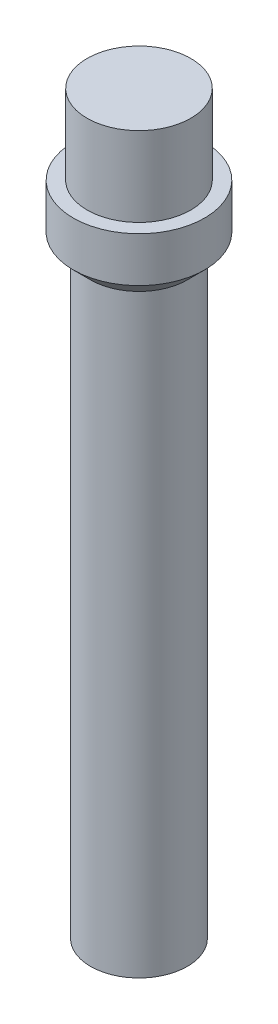
ISO-10303-21;
HEADER;
FILE_DESCRIPTION(('STEP AP214'),'2;1');
FILE_NAME('part.step','',(''),(''),'','','');
FILE_SCHEMA(('AUTOMOTIVE_DESIGN { 1 0 10303 214 1 1 1 1 }'));
ENDSEC;
DATA;
#1=APPLICATION_CONTEXT('core data for automotive mechanical design processes');
#2=APPLICATION_PROTOCOL_DEFINITION('international standard','automotive_design',2000,#1);
#3=PRODUCT_CONTEXT('',#1,'mechanical');
#4=PRODUCT('Part','Part','',(#3));
#5=PRODUCT_RELATED_PRODUCT_CATEGORY('part','',(#4));
#6=PRODUCT_DEFINITION_FORMATION('','',#4);
#7=PRODUCT_DEFINITION_CONTEXT('part definition',#1,'design');
#8=PRODUCT_DEFINITION('design','',#6,#7);
#9=PRODUCT_DEFINITION_SHAPE('','',#8);
#10=(LENGTH_UNIT() NAMED_UNIT(*) SI_UNIT(.MILLI.,.METRE.));
#11=(NAMED_UNIT(*) PLANE_ANGLE_UNIT() SI_UNIT($,.RADIAN.));
#12=(NAMED_UNIT(*) SI_UNIT($,.STERADIAN.) SOLID_ANGLE_UNIT());
#13=UNCERTAINTY_MEASURE_WITH_UNIT(LENGTH_MEASURE(1.E-05),#10,'distance_accuracy_value','');
#14=(GEOMETRIC_REPRESENTATION_CONTEXT(3) GLOBAL_UNCERTAINTY_ASSIGNED_CONTEXT((#13)) GLOBAL_UNIT_ASSIGNED_CONTEXT((#10,
#11,#12)) REPRESENTATION_CONTEXT('',''));
#15=CARTESIAN_POINT('',(0.,0.,0.));
#16=DIRECTION('',(0.,0.,1.));
#17=DIRECTION('',(1.,0.,0.));
#18=AXIS2_PLACEMENT_3D('',#15,#16,#17);
#19=CARTESIAN_POINT('',(0.,2.3,0.));
#20=DIRECTION('',(0.,-1.,0.));
#21=DIRECTION('',(0.,0.,-1.));
#22=AXIS2_PLACEMENT_3D('',#19,#20,#21);
#23=CYLINDRICAL_SURFACE('',#22,1.5);
#24=CARTESIAN_POINT('',(0.,2.3,0.));
#25=DIRECTION('',(0.,1.,0.));
#26=DIRECTION('',(0.,0.,1.));
#27=AXIS2_PLACEMENT_3D('',#24,#25,#26);
#28=CIRCLE('',#27,1.5);
#29=CARTESIAN_POINT('',(0.,2.3,1.5));
#30=VERTEX_POINT('',#29);
#31=EDGE_CURVE('E45',#30,#30,#28,.T.);
#32=ORIENTED_EDGE('',*,*,#31,.F.);
#33=EDGE_LOOP('',(#32));
#34=FACE_BOUND('',#33,.T.);
#35=CARTESIAN_POINT('',(0.,0.,0.));
#36=DIRECTION('',(0.,1.,0.));
#37=DIRECTION('',(0.,0.,1.));
#38=AXIS2_PLACEMENT_3D('',#35,#36,#37);
#39=CIRCLE('',#38,1.5);
#40=CARTESIAN_POINT('',(0.,0.,1.5));
#41=VERTEX_POINT('',#40);
#42=EDGE_CURVE('E50',#41,#41,#39,.T.);
#43=ORIENTED_EDGE('',*,*,#42,.T.);
#44=EDGE_LOOP('',(#43));
#45=FACE_BOUND('',#44,.T.);
#46=ADVANCED_FACE('F37',(#34,#45),#23,.T.);
#47=CARTESIAN_POINT('',(0.,2.3,0.));
#48=DIRECTION('',(0.,1.,0.));
#49=DIRECTION('',(0.,0.,1.));
#50=AXIS2_PLACEMENT_3D('',#47,#48,#49);
#51=PLANE('',#50);
#52=ORIENTED_EDGE('',*,*,#31,.T.);
#53=EDGE_LOOP('',(#52));
#54=FACE_BOUND('',#53,.T.);
#55=ADVANCED_FACE('F83',(#54),#51,.T.);
#56=CARTESIAN_POINT('',(0.,-1.3,0.));
#57=DIRECTION('',(0.,1.,0.));
#58=DIRECTION('',(0.,0.,1.));
#59=AXIS2_PLACEMENT_3D('',#56,#57,#58);
#60=CYLINDRICAL_SURFACE('',#59,1.9);
#61=CARTESIAN_POINT('',(0.,-1.3,0.));
#62=DIRECTION('',(0.,1.,0.));
#63=DIRECTION('',(0.,0.,1.));
#64=AXIS2_PLACEMENT_3D('',#61,#62,#63);
#65=CIRCLE('',#64,1.9);
#66=CARTESIAN_POINT('',(0.,-1.3,1.9));
#67=VERTEX_POINT('',#66);
#68=EDGE_CURVE('E56',#67,#67,#65,.T.);
#69=ORIENTED_EDGE('',*,*,#68,.T.);
#70=EDGE_LOOP('',(#69));
#71=FACE_BOUND('',#70,.T.);
#72=CARTESIAN_POINT('',(0.,0.,0.));
#73=DIRECTION('',(0.,1.,0.));
#74=DIRECTION('',(0.,0.,1.));
#75=AXIS2_PLACEMENT_3D('',#72,#73,#74);
#76=CIRCLE('',#75,1.9);
#77=CARTESIAN_POINT('',(0.,0.,1.9));
#78=VERTEX_POINT('',#77);
#79=EDGE_CURVE('E58',#78,#78,#76,.T.);
#80=ORIENTED_EDGE('',*,*,#79,.F.);
#81=EDGE_LOOP('',(#80));
#82=FACE_BOUND('',#81,.T.);
#83=ADVANCED_FACE('F88',(#71,#82),#60,.T.);
#84=CARTESIAN_POINT('',(0.,0.,0.));
#85=DIRECTION('',(0.,1.,0.));
#86=DIRECTION('',(0.,0.,1.));
#87=AXIS2_PLACEMENT_3D('',#84,#85,#86);
#88=PLANE('',#87);
#89=ORIENTED_EDGE('',*,*,#42,.F.);
#90=EDGE_LOOP('',(#89));
#91=FACE_BOUND('',#90,.T.);
#92=ORIENTED_EDGE('',*,*,#79,.T.);
#93=EDGE_LOOP('',(#92));
#94=FACE_BOUND('',#93,.T.);
#95=ADVANCED_FACE('F80',(#91,#94),#88,.T.);
#96=CARTESIAN_POINT('',(0.,-19.,0.));
#97=DIRECTION('',(0.,1.,0.));
#98=DIRECTION('',(0.,0.,1.));
#99=AXIS2_PLACEMENT_3D('',#96,#97,#98);
#100=CYLINDRICAL_SURFACE('',#99,1.4);
#101=CARTESIAN_POINT('',(0.,-1.8,0.));
#102=DIRECTION('',(0.,1.,0.));
#103=DIRECTION('',(0.,0.,1.));
#104=AXIS2_PLACEMENT_3D('',#101,#102,#103);
#105=CIRCLE('',#104,1.4);
#106=CARTESIAN_POINT('',(0.,-1.8,1.4));
#107=VERTEX_POINT('',#106);
#108=EDGE_CURVE('E10',#107,#107,#105,.F.);
#109=ORIENTED_EDGE('',*,*,#108,.T.);
#110=EDGE_LOOP('',(#109));
#111=FACE_BOUND('',#110,.T.);
#112=CARTESIAN_POINT('',(0.,-19.,0.));
#113=DIRECTION('',(0.,1.,0.));
#114=DIRECTION('',(0.,0.,1.));
#115=AXIS2_PLACEMENT_3D('',#112,#113,#114);
#116=CIRCLE('',#115,1.4);
#117=CARTESIAN_POINT('',(0.,-19.,1.4));
#118=VERTEX_POINT('',#117);
#119=EDGE_CURVE('E62',#118,#118,#116,.T.);
#120=ORIENTED_EDGE('',*,*,#119,.T.);
#121=EDGE_LOOP('',(#120));
#122=FACE_BOUND('',#121,.T.);
#123=ADVANCED_FACE('F70',(#111,#122),#100,.T.);
#124=CARTESIAN_POINT('',(0.,-19.,0.));
#125=DIRECTION('',(0.,1.,0.));
#126=DIRECTION('',(0.,0.,1.));
#127=AXIS2_PLACEMENT_3D('',#124,#125,#126);
#128=PLANE('',#127);
#129=ORIENTED_EDGE('',*,*,#119,.F.);
#130=EDGE_LOOP('',(#129));
#131=FACE_BOUND('',#130,.T.);
#132=ADVANCED_FACE('F72',(#131),#128,.F.);
#133=CARTESIAN_POINT('',(0.,-1.3,0.));
#134=DIRECTION('',(0.,1.,0.));
#135=DIRECTION('',(0.,0.,1.));
#136=AXIS2_PLACEMENT_3D('',#133,#134,#135);
#137=CONICAL_SURFACE('',#136,1.9,0.785398163397452);
#138=ORIENTED_EDGE('',*,*,#108,.F.);
#139=EDGE_LOOP('',(#138));
#140=FACE_BOUND('',#139,.T.);
#141=ORIENTED_EDGE('',*,*,#68,.F.);
#142=EDGE_LOOP('',(#141));
#143=FACE_BOUND('',#142,.T.);
#144=ADVANCED_FACE('F39',(#140,#143),#137,.T.);
#145=CLOSED_SHELL('',(#46,#55,#83,#95,#123,#132,#144));
#146=MANIFOLD_SOLID_BREP('B2',#145);
#147=ADVANCED_BREP_SHAPE_REPRESENTATION('',(#18,#146),#14);
#148=SHAPE_DEFINITION_REPRESENTATION(#9,#147);
ENDSEC;
END-ISO-10303-21;
